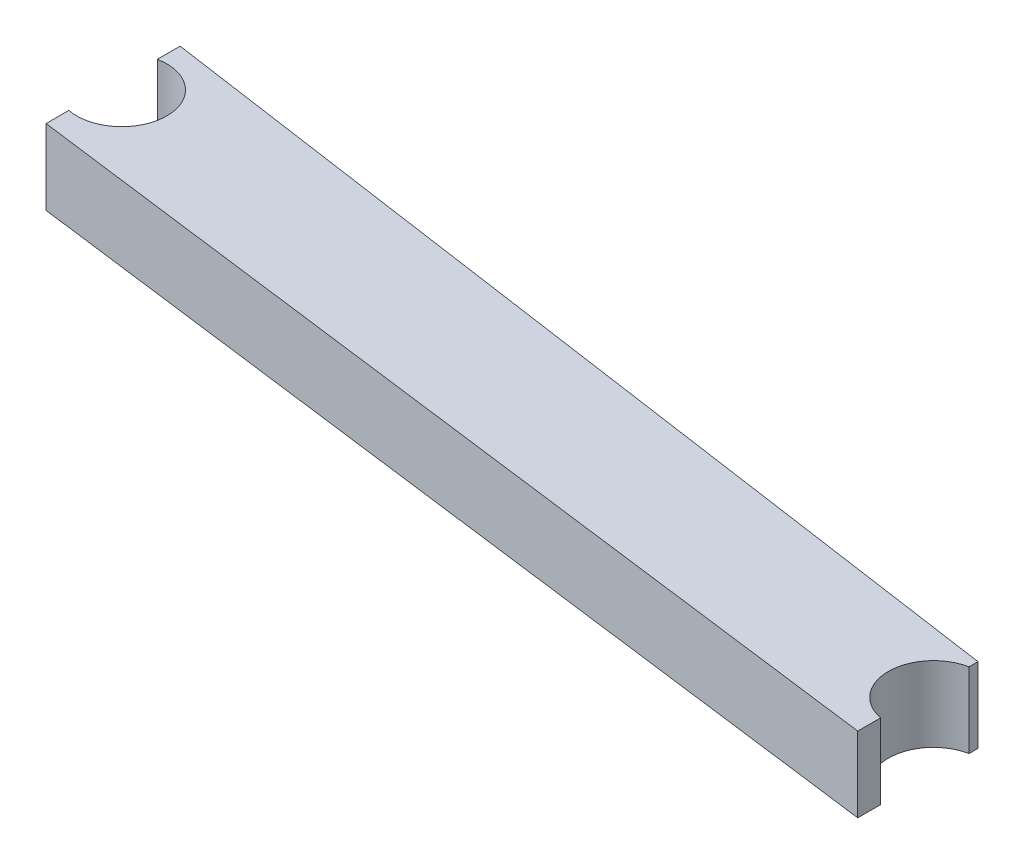
ISO-10303-21;
HEADER;
FILE_DESCRIPTION(('STEP AP214'),'2;1');
FILE_NAME('part.step','',(''),(''),'','','');
FILE_SCHEMA(('AUTOMOTIVE_DESIGN { 1 0 10303 214 1 1 1 1 }'));
ENDSEC;
DATA;
#1=APPLICATION_CONTEXT('core data for automotive mechanical design processes');
#2=APPLICATION_PROTOCOL_DEFINITION('international standard','automotive_design',2000,#1);
#3=PRODUCT_CONTEXT('',#1,'mechanical');
#4=PRODUCT('Part','Part','',(#3));
#5=PRODUCT_RELATED_PRODUCT_CATEGORY('part','',(#4));
#6=PRODUCT_DEFINITION_FORMATION('','',#4);
#7=PRODUCT_DEFINITION_CONTEXT('part definition',#1,'design');
#8=PRODUCT_DEFINITION('design','',#6,#7);
#9=PRODUCT_DEFINITION_SHAPE('','',#8);
#10=(LENGTH_UNIT() NAMED_UNIT(*) SI_UNIT(.MILLI.,.METRE.));
#11=(NAMED_UNIT(*) PLANE_ANGLE_UNIT() SI_UNIT($,.RADIAN.));
#12=(NAMED_UNIT(*) SI_UNIT($,.STERADIAN.) SOLID_ANGLE_UNIT());
#13=UNCERTAINTY_MEASURE_WITH_UNIT(LENGTH_MEASURE(1.E-05),#10,'distance_accuracy_value','');
#14=(GEOMETRIC_REPRESENTATION_CONTEXT(3) GLOBAL_UNCERTAINTY_ASSIGNED_CONTEXT((#13)) GLOBAL_UNIT_ASSIGNED_CONTEXT((#10,
#11,#12)) REPRESENTATION_CONTEXT('',''));
#15=CARTESIAN_POINT('',(0.,0.,0.));
#16=DIRECTION('',(0.,0.,1.));
#17=DIRECTION('',(1.,0.,0.));
#18=AXIS2_PLACEMENT_3D('',#15,#16,#17);
#19=CARTESIAN_POINT('',(17.42,10.,49.54));
#20=DIRECTION('',(1.,0.,0.));
#21=DIRECTION('',(0.,0.,-1.));
#22=AXIS2_PLACEMENT_3D('',#19,#20,#21);
#23=PLANE('',#22);
#24=DIRECTION('',(0.,-1.,0.));
#25=VECTOR('',#24,1.);
#26=CARTESIAN_POINT('',(17.42,10.,56.9433993952571));
#27=LINE('',#26,#25);
#28=CARTESIAN_POINT('',(17.42,5.,56.9433993952571));
#29=VERTEX_POINT('',#28);
#30=CARTESIAN_POINT('',(17.42,10.,56.9433993952571));
#31=VERTEX_POINT('',#30);
#32=EDGE_CURVE('E163',#29,#31,#27,.F.);
#33=ORIENTED_EDGE('',*,*,#32,.F.);
#34=DIRECTION('',(0.,0.,1.));
#35=VECTOR('',#34,1.);
#36=CARTESIAN_POINT('',(17.42,5.,49.54));
#37=LINE('',#36,#35);
#38=CARTESIAN_POINT('',(17.42,5.,58.46));
#39=VERTEX_POINT('',#38);
#40=EDGE_CURVE('E140',#29,#39,#37,.T.);
#41=ORIENTED_EDGE('',*,*,#40,.T.);
#42=DIRECTION('',(0.,-1.,0.));
#43=VECTOR('',#42,1.);
#44=CARTESIAN_POINT('',(17.42,10.,58.46));
#45=LINE('',#44,#43);
#46=CARTESIAN_POINT('',(17.42,10.,58.46));
#47=VERTEX_POINT('',#46);
#48=EDGE_CURVE('E155',#47,#39,#45,.T.);
#49=ORIENTED_EDGE('',*,*,#48,.F.);
#50=DIRECTION('',(0.,0.,1.));
#51=VECTOR('',#50,1.);
#52=CARTESIAN_POINT('',(17.42,10.,49.54));
#53=LINE('',#52,#51);
#54=EDGE_CURVE('E144',#31,#47,#53,.T.);
#55=ORIENTED_EDGE('',*,*,#54,.F.);
#56=EDGE_LOOP('',(#33,#41,#49,#55));
#57=FACE_BOUND('',#56,.T.);
#58=ADVANCED_FACE('F41',(#57),#23,.F.);
#59=DIRECTION('',(0.,-1.,0.));
#60=VECTOR('',#59,1.);
#61=CARTESIAN_POINT('',(17.42,10.,51.0566006047429));
#62=LINE('',#61,#60);
#63=CARTESIAN_POINT('',(17.42,10.,51.0566006047429));
#64=VERTEX_POINT('',#63);
#65=CARTESIAN_POINT('',(17.42,5.,51.0566006047429));
#66=VERTEX_POINT('',#65);
#67=EDGE_CURVE('E62',#64,#66,#62,.T.);
#68=ORIENTED_EDGE('',*,*,#67,.F.);
#69=CARTESIAN_POINT('',(17.42,10.,49.54));
#70=VERTEX_POINT('',#69);
#71=EDGE_CURVE('E130',#70,#64,#53,.T.);
#72=ORIENTED_EDGE('',*,*,#71,.F.);
#73=DIRECTION('',(0.,-1.,0.));
#74=VECTOR('',#73,1.);
#75=CARTESIAN_POINT('',(17.42,10.,49.54));
#76=LINE('',#75,#74);
#77=CARTESIAN_POINT('',(17.42,5.,49.54));
#78=VERTEX_POINT('',#77);
#79=EDGE_CURVE('E132',#70,#78,#76,.T.);
#80=ORIENTED_EDGE('',*,*,#79,.T.);
#81=EDGE_CURVE('E134',#78,#66,#37,.T.);
#82=ORIENTED_EDGE('',*,*,#81,.T.);
#83=EDGE_LOOP('',(#68,#72,#80,#82));
#84=FACE_BOUND('',#83,.T.);
#85=ADVANCED_FACE('F178',(#84),#23,.F.);
#86=CARTESIAN_POINT('',(79.42,10.,66.46));
#87=DIRECTION('',(-1.,0.,0.));
#88=DIRECTION('',(0.,0.,1.));
#89=AXIS2_PLACEMENT_3D('',#86,#87,#88);
#90=PLANE('',#89);
#91=DIRECTION('',(0.,-1.,0.));
#92=VECTOR('',#91,1.);
#93=CARTESIAN_POINT('',(79.42,10.,59.0566006047429));
#94=LINE('',#93,#92);
#95=CARTESIAN_POINT('',(79.42,5.,59.0566006047429));
#96=VERTEX_POINT('',#95);
#97=CARTESIAN_POINT('',(79.42,10.,59.0566006047429));
#98=VERTEX_POINT('',#97);
#99=EDGE_CURVE('E105',#96,#98,#94,.F.);
#100=ORIENTED_EDGE('',*,*,#99,.F.);
#101=DIRECTION('',(0.,0.,-1.));
#102=VECTOR('',#101,1.);
#103=CARTESIAN_POINT('',(79.42,5.,66.46));
#104=LINE('',#103,#102);
#105=CARTESIAN_POINT('',(79.42,5.,58.46));
#106=VERTEX_POINT('',#105);
#107=EDGE_CURVE('E137',#96,#106,#104,.T.);
#108=ORIENTED_EDGE('',*,*,#107,.T.);
#109=DIRECTION('',(0.,-1.,0.));
#110=VECTOR('',#109,1.);
#111=CARTESIAN_POINT('',(79.42,10.,58.46));
#112=LINE('',#111,#110);
#113=CARTESIAN_POINT('',(79.42,10.,58.46));
#114=VERTEX_POINT('',#113);
#115=EDGE_CURVE('E125',#114,#106,#112,.T.);
#116=ORIENTED_EDGE('',*,*,#115,.F.);
#117=DIRECTION('',(0.,0.,-1.));
#118=VECTOR('',#117,1.);
#119=CARTESIAN_POINT('',(79.42,10.,66.46));
#120=LINE('',#119,#118);
#121=EDGE_CURVE('E111',#98,#114,#120,.T.);
#122=ORIENTED_EDGE('',*,*,#121,.F.);
#123=EDGE_LOOP('',(#100,#108,#116,#122));
#124=FACE_BOUND('',#123,.T.);
#125=ADVANCED_FACE('F120',(#124),#90,.F.);
#126=DIRECTION('',(0.,-1.,0.));
#127=VECTOR('',#126,1.);
#128=CARTESIAN_POINT('',(79.42,10.,64.9433993952571));
#129=LINE('',#128,#127);
#130=CARTESIAN_POINT('',(79.42,10.,64.9433993952571));
#131=VERTEX_POINT('',#130);
#132=CARTESIAN_POINT('',(79.42,5.,64.9433993952571));
#133=VERTEX_POINT('',#132);
#134=EDGE_CURVE('E54',#131,#133,#129,.T.);
#135=ORIENTED_EDGE('',*,*,#134,.F.);
#136=CARTESIAN_POINT('',(79.42,10.,66.46));
#137=VERTEX_POINT('',#136);
#138=EDGE_CURVE('E117',#137,#131,#120,.T.);
#139=ORIENTED_EDGE('',*,*,#138,.F.);
#140=DIRECTION('',(0.,-1.,0.));
#141=VECTOR('',#140,1.);
#142=CARTESIAN_POINT('',(79.42,10.,66.46));
#143=LINE('',#142,#141);
#144=CARTESIAN_POINT('',(79.42,5.,66.46));
#145=VERTEX_POINT('',#144);
#146=EDGE_CURVE('E149',#137,#145,#143,.T.);
#147=ORIENTED_EDGE('',*,*,#146,.T.);
#148=EDGE_CURVE('E139',#145,#133,#104,.T.);
#149=ORIENTED_EDGE('',*,*,#148,.T.);
#150=EDGE_LOOP('',(#135,#139,#147,#149));
#151=FACE_BOUND('',#150,.T.);
#152=ADVANCED_FACE('F166',(#151),#90,.F.);
#153=CARTESIAN_POINT('',(0.,10.,0.));
#154=DIRECTION('',(0.,1.,0.));
#155=DIRECTION('',(0.,0.,1.));
#156=AXIS2_PLACEMENT_3D('',#153,#154,#155);
#157=PLANE('',#156);
#158=CARTESIAN_POINT('',(18.,10.,54.));
#159=DIRECTION('',(0.,1.,0.));
#160=DIRECTION('',(0.,0.,1.));
#161=AXIS2_PLACEMENT_3D('',#158,#159,#160);
#162=CIRCLE('',#161,3.);
#163=EDGE_CURVE('E119',#31,#64,#162,.T.);
#164=ORIENTED_EDGE('',*,*,#163,.F.);
#165=ORIENTED_EDGE('',*,*,#54,.T.);
#166=DIRECTION('',(0.991777866634025,0.,0.127971337630197));
#167=VECTOR('',#166,1.);
#168=CARTESIAN_POINT('',(17.42,10.,58.46));
#169=LINE('',#168,#167);
#170=EDGE_CURVE('E122',#47,#137,#169,.T.);
#171=ORIENTED_EDGE('',*,*,#170,.T.);
#172=ORIENTED_EDGE('',*,*,#138,.T.);
#173=CARTESIAN_POINT('',(80.,10.,62.));
#174=DIRECTION('',(0.,1.,0.));
#175=DIRECTION('',(0.,0.,1.));
#176=AXIS2_PLACEMENT_3D('',#173,#174,#175);
#177=CIRCLE('',#176,3.00000000000001);
#178=EDGE_CURVE('E104',#98,#131,#177,.T.);
#179=ORIENTED_EDGE('',*,*,#178,.F.);
#180=ORIENTED_EDGE('',*,*,#121,.T.);
#181=DIRECTION('',(-0.98980851624093,0.,-0.142404709110792));
#182=VECTOR('',#181,1.);
#183=CARTESIAN_POINT('',(79.42,10.,58.46));
#184=LINE('',#183,#182);
#185=EDGE_CURVE('E127',#114,#70,#184,.T.);
#186=ORIENTED_EDGE('',*,*,#185,.T.);
#187=ORIENTED_EDGE('',*,*,#71,.T.);
#188=EDGE_LOOP('',(#164,#165,#171,#172,#179,#180,#186,#187));
#189=FACE_BOUND('',#188,.T.);
#190=ADVANCED_FACE('F114',(#189),#157,.T.);
#191=CARTESIAN_POINT('',(17.42,10.,58.46));
#192=DIRECTION('',(0.127971337630197,0.,-0.991777866634025));
#193=DIRECTION('',(-0.991777866634025,0.,-0.127971337630197));
#194=AXIS2_PLACEMENT_3D('',#191,#192,#193);
#195=PLANE('',#194);
#196=DIRECTION('',(0.991777866634025,0.,0.127971337630197));
#197=VECTOR('',#196,1.);
#198=CARTESIAN_POINT('',(17.42,5.,58.46));
#199=LINE('',#198,#197);
#200=EDGE_CURVE('E136',#39,#145,#199,.T.);
#201=ORIENTED_EDGE('',*,*,#200,.T.);
#202=ORIENTED_EDGE('',*,*,#146,.F.);
#203=ORIENTED_EDGE('',*,*,#170,.F.);
#204=ORIENTED_EDGE('',*,*,#48,.T.);
#205=EDGE_LOOP('',(#201,#202,#203,#204));
#206=FACE_BOUND('',#205,.T.);
#207=ADVANCED_FACE('F160',(#206),#195,.F.);
#208=CARTESIAN_POINT('',(79.42,10.,58.46));
#209=DIRECTION('',(-0.142404709110792,0.,0.98980851624093));
#210=DIRECTION('',(0.98980851624093,0.,0.142404709110792));
#211=AXIS2_PLACEMENT_3D('',#208,#209,#210);
#212=PLANE('',#211);
#213=DIRECTION('',(-0.98980851624093,0.,-0.142404709110792));
#214=VECTOR('',#213,1.);
#215=CARTESIAN_POINT('',(79.42,5.,58.46));
#216=LINE('',#215,#214);
#217=EDGE_CURVE('E141',#106,#78,#216,.T.);
#218=ORIENTED_EDGE('',*,*,#217,.T.);
#219=ORIENTED_EDGE('',*,*,#79,.F.);
#220=ORIENTED_EDGE('',*,*,#185,.F.);
#221=ORIENTED_EDGE('',*,*,#115,.T.);
#222=EDGE_LOOP('',(#218,#219,#220,#221));
#223=FACE_BOUND('',#222,.T.);
#224=ADVANCED_FACE('F181',(#223),#212,.F.);
#225=CARTESIAN_POINT('',(0.,5.,0.));
#226=DIRECTION('',(0.,1.,0.));
#227=DIRECTION('',(0.,0.,1.));
#228=AXIS2_PLACEMENT_3D('',#225,#226,#227);
#229=PLANE('',#228);
#230=CARTESIAN_POINT('',(18.,5.,54.));
#231=DIRECTION('',(0.,1.,0.));
#232=DIRECTION('',(0.,0.,1.));
#233=AXIS2_PLACEMENT_3D('',#230,#231,#232);
#234=CIRCLE('',#233,3.);
#235=EDGE_CURVE('E11',#66,#29,#234,.F.);
#236=ORIENTED_EDGE('',*,*,#235,.F.);
#237=ORIENTED_EDGE('',*,*,#81,.F.);
#238=ORIENTED_EDGE('',*,*,#217,.F.);
#239=ORIENTED_EDGE('',*,*,#107,.F.);
#240=CARTESIAN_POINT('',(80.,5.,62.));
#241=DIRECTION('',(0.,1.,0.));
#242=DIRECTION('',(0.,0.,1.));
#243=AXIS2_PLACEMENT_3D('',#240,#241,#242);
#244=CIRCLE('',#243,3.00000000000001);
#245=EDGE_CURVE('E48',#133,#96,#244,.F.);
#246=ORIENTED_EDGE('',*,*,#245,.F.);
#247=ORIENTED_EDGE('',*,*,#148,.F.);
#248=ORIENTED_EDGE('',*,*,#200,.F.);
#249=ORIENTED_EDGE('',*,*,#40,.F.);
#250=EDGE_LOOP('',(#236,#237,#238,#239,#246,#247,#248,#249));
#251=FACE_BOUND('',#250,.T.);
#252=ADVANCED_FACE('F170',(#251),#229,.F.);
#253=CARTESIAN_POINT('',(80.,10.,62.));
#254=DIRECTION('',(0.,-1.,0.));
#255=DIRECTION('',(0.,0.,-1.));
#256=AXIS2_PLACEMENT_3D('',#253,#254,#255);
#257=CYLINDRICAL_SURFACE('',#256,3.00000000000001);
#258=ORIENTED_EDGE('',*,*,#99,.T.);
#259=ORIENTED_EDGE('',*,*,#178,.T.);
#260=ORIENTED_EDGE('',*,*,#134,.T.);
#261=ORIENTED_EDGE('',*,*,#245,.T.);
#262=EDGE_LOOP('',(#258,#259,#260,#261));
#263=FACE_BOUND('',#262,.T.);
#264=ADVANCED_FACE('F102',(#263),#257,.F.);
#265=CARTESIAN_POINT('',(18.,10.,54.));
#266=DIRECTION('',(0.,-1.,0.));
#267=DIRECTION('',(0.,0.,-1.));
#268=AXIS2_PLACEMENT_3D('',#265,#266,#267);
#269=CYLINDRICAL_SURFACE('',#268,3.);
#270=ORIENTED_EDGE('',*,*,#32,.T.);
#271=ORIENTED_EDGE('',*,*,#163,.T.);
#272=ORIENTED_EDGE('',*,*,#67,.T.);
#273=ORIENTED_EDGE('',*,*,#235,.T.);
#274=EDGE_LOOP('',(#270,#271,#272,#273));
#275=FACE_BOUND('',#274,.T.);
#276=ADVANCED_FACE('F176',(#275),#269,.F.);
#277=CLOSED_SHELL('',(#58,#85,#125,#152,#190,#207,#224,#252,#264,#276));
#278=MANIFOLD_SOLID_BREP('B2',#277);
#279=ADVANCED_BREP_SHAPE_REPRESENTATION('',(#18,#278),#14);
#280=SHAPE_DEFINITION_REPRESENTATION(#9,#279);
ENDSEC;
END-ISO-10303-21;
